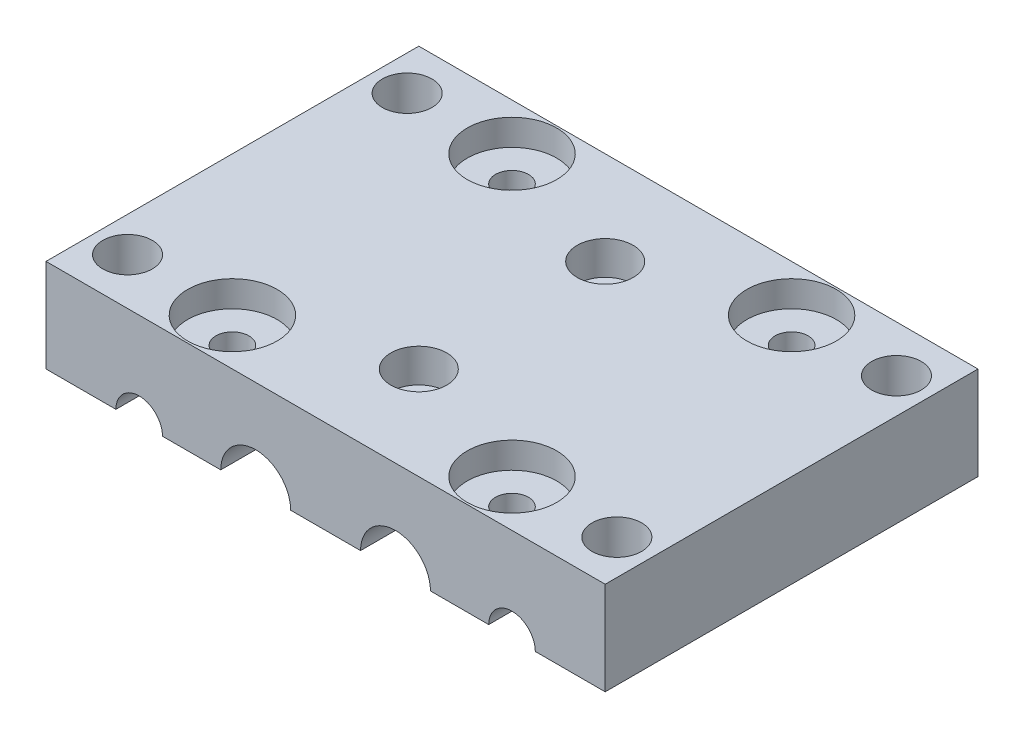
ISO-10303-21;
HEADER;
FILE_DESCRIPTION(('STEP AP214'),'2;1');
FILE_NAME('part.step','',(''),(''),'','','');
FILE_SCHEMA(('AUTOMOTIVE_DESIGN { 1 0 10303 214 1 1 1 1 }'));
ENDSEC;
DATA;
#1=APPLICATION_CONTEXT('core data for automotive mechanical design processes');
#2=APPLICATION_PROTOCOL_DEFINITION('international standard','automotive_design',2000,#1);
#3=PRODUCT_CONTEXT('',#1,'mechanical');
#4=PRODUCT('Part','Part','',(#3));
#5=PRODUCT_RELATED_PRODUCT_CATEGORY('part','',(#4));
#6=PRODUCT_DEFINITION_FORMATION('','',#4);
#7=PRODUCT_DEFINITION_CONTEXT('part definition',#1,'design');
#8=PRODUCT_DEFINITION('design','',#6,#7);
#9=PRODUCT_DEFINITION_SHAPE('','',#8);
#10=(LENGTH_UNIT() NAMED_UNIT(*) SI_UNIT(.MILLI.,.METRE.));
#11=(NAMED_UNIT(*) PLANE_ANGLE_UNIT() SI_UNIT($,.RADIAN.));
#12=(NAMED_UNIT(*) SI_UNIT($,.STERADIAN.) SOLID_ANGLE_UNIT());
#13=UNCERTAINTY_MEASURE_WITH_UNIT(LENGTH_MEASURE(1.E-05),#10,'distance_accuracy_value','');
#14=(GEOMETRIC_REPRESENTATION_CONTEXT(3) GLOBAL_UNCERTAINTY_ASSIGNED_CONTEXT((#13)) GLOBAL_UNIT_ASSIGNED_CONTEXT((#10,
#11,#12)) REPRESENTATION_CONTEXT('',''));
#15=CARTESIAN_POINT('',(0.,0.,0.));
#16=DIRECTION('',(0.,0.,1.));
#17=DIRECTION('',(1.,0.,0.));
#18=AXIS2_PLACEMENT_3D('',#15,#16,#17);
#19=CARTESIAN_POINT('',(19.05,12.7,-19.05));
#20=DIRECTION('',(0.,1.,0.));
#21=DIRECTION('',(0.,0.,1.));
#22=AXIS2_PLACEMENT_3D('',#19,#20,#21);
#23=CYLINDRICAL_SURFACE('',#22,2.24789999999999);
#24=CARTESIAN_POINT('',(19.05,0.,-19.05));
#25=DIRECTION('',(0.,1.,0.));
#26=DIRECTION('',(0.,0.,1.));
#27=AXIS2_PLACEMENT_3D('',#24,#25,#26);
#28=CIRCLE('',#27,2.24789999999999);
#29=CARTESIAN_POINT('',(19.05,0.,-16.8021));
#30=VERTEX_POINT('',#29);
#31=EDGE_CURVE('E244',#30,#30,#28,.T.);
#32=ORIENTED_EDGE('',*,*,#31,.F.);
#33=EDGE_LOOP('',(#32));
#34=FACE_BOUND('',#33,.T.);
#35=CARTESIAN_POINT('',(19.05,9.144,-19.05));
#36=DIRECTION('',(0.,1.,0.));
#37=DIRECTION('',(0.,0.,1.));
#38=AXIS2_PLACEMENT_3D('',#35,#36,#37);
#39=CIRCLE('',#38,2.24789999999999);
#40=CARTESIAN_POINT('',(19.05,9.144,-16.8021));
#41=VERTEX_POINT('',#40);
#42=EDGE_CURVE('E38',#41,#41,#39,.F.);
#43=ORIENTED_EDGE('',*,*,#42,.F.);
#44=EDGE_LOOP('',(#43));
#45=FACE_BOUND('',#44,.T.);
#46=ADVANCED_FACE('F34',(#34,#45),#23,.F.);
#47=CARTESIAN_POINT('',(19.05,12.7,19.05));
#48=DIRECTION('',(0.,1.,0.));
#49=DIRECTION('',(0.,0.,1.));
#50=AXIS2_PLACEMENT_3D('',#47,#48,#49);
#51=CYLINDRICAL_SURFACE('',#50,2.24789999999999);
#52=CARTESIAN_POINT('',(19.05,0.,19.05));
#53=DIRECTION('',(0.,1.,0.));
#54=DIRECTION('',(0.,0.,1.));
#55=AXIS2_PLACEMENT_3D('',#52,#53,#54);
#56=CIRCLE('',#55,2.24789999999999);
#57=CARTESIAN_POINT('',(19.05,0.,21.2979));
#58=VERTEX_POINT('',#57);
#59=EDGE_CURVE('E241',#58,#58,#56,.T.);
#60=ORIENTED_EDGE('',*,*,#59,.F.);
#61=EDGE_LOOP('',(#60));
#62=FACE_BOUND('',#61,.T.);
#63=CARTESIAN_POINT('',(19.05,9.144,19.05));
#64=DIRECTION('',(0.,1.,0.));
#65=DIRECTION('',(0.,0.,1.));
#66=AXIS2_PLACEMENT_3D('',#63,#64,#65);
#67=CIRCLE('',#66,2.24789999999999);
#68=CARTESIAN_POINT('',(19.05,9.144,21.2979));
#69=VERTEX_POINT('',#68);
#70=EDGE_CURVE('E203',#69,#69,#67,.F.);
#71=ORIENTED_EDGE('',*,*,#70,.F.);
#72=EDGE_LOOP('',(#71));
#73=FACE_BOUND('',#72,.T.);
#74=ADVANCED_FACE('F356',(#62,#73),#51,.F.);
#75=CARTESIAN_POINT('',(-19.05,12.7,19.05));
#76=DIRECTION('',(0.,1.,0.));
#77=DIRECTION('',(0.,0.,1.));
#78=AXIS2_PLACEMENT_3D('',#75,#76,#77);
#79=CYLINDRICAL_SURFACE('',#78,2.24789999999999);
#80=CARTESIAN_POINT('',(-19.05,0.,19.05));
#81=DIRECTION('',(0.,1.,0.));
#82=DIRECTION('',(0.,0.,1.));
#83=AXIS2_PLACEMENT_3D('',#80,#81,#82);
#84=CIRCLE('',#83,2.24789999999999);
#85=CARTESIAN_POINT('',(-19.05,0.,21.2979));
#86=VERTEX_POINT('',#85);
#87=EDGE_CURVE('E238',#86,#86,#84,.T.);
#88=ORIENTED_EDGE('',*,*,#87,.F.);
#89=EDGE_LOOP('',(#88));
#90=FACE_BOUND('',#89,.T.);
#91=CARTESIAN_POINT('',(-19.05,9.144,19.05));
#92=DIRECTION('',(0.,1.,0.));
#93=DIRECTION('',(0.,0.,1.));
#94=AXIS2_PLACEMENT_3D('',#91,#92,#93);
#95=CIRCLE('',#94,2.24789999999999);
#96=CARTESIAN_POINT('',(-19.05,9.144,21.2979));
#97=VERTEX_POINT('',#96);
#98=EDGE_CURVE('E199',#97,#97,#95,.F.);
#99=ORIENTED_EDGE('',*,*,#98,.F.);
#100=EDGE_LOOP('',(#99));
#101=FACE_BOUND('',#100,.T.);
#102=ADVANCED_FACE('F363',(#90,#101),#79,.F.);
#103=CARTESIAN_POINT('',(-19.05,12.7,-19.05));
#104=DIRECTION('',(0.,1.,0.));
#105=DIRECTION('',(0.,0.,1.));
#106=AXIS2_PLACEMENT_3D('',#103,#104,#105);
#107=CYLINDRICAL_SURFACE('',#106,2.24789999999999);
#108=CARTESIAN_POINT('',(-19.05,0.,-19.05));
#109=DIRECTION('',(0.,1.,0.));
#110=DIRECTION('',(0.,0.,1.));
#111=AXIS2_PLACEMENT_3D('',#108,#109,#110);
#112=CIRCLE('',#111,2.24789999999999);
#113=CARTESIAN_POINT('',(-19.05,0.,-16.8021));
#114=VERTEX_POINT('',#113);
#115=EDGE_CURVE('E187',#114,#114,#112,.T.);
#116=ORIENTED_EDGE('',*,*,#115,.F.);
#117=EDGE_LOOP('',(#116));
#118=FACE_BOUND('',#117,.T.);
#119=CARTESIAN_POINT('',(-19.05,9.144,-19.05));
#120=DIRECTION('',(0.,1.,0.));
#121=DIRECTION('',(0.,0.,1.));
#122=AXIS2_PLACEMENT_3D('',#119,#120,#121);
#123=CIRCLE('',#122,2.24789999999999);
#124=CARTESIAN_POINT('',(-19.05,9.144,-16.8021));
#125=VERTEX_POINT('',#124);
#126=EDGE_CURVE('E194',#125,#125,#123,.F.);
#127=ORIENTED_EDGE('',*,*,#126,.F.);
#128=EDGE_LOOP('',(#127));
#129=FACE_BOUND('',#128,.T.);
#130=ADVANCED_FACE('F377',(#118,#129),#107,.F.);
#131=CARTESIAN_POINT('',(0.,12.7,12.7));
#132=DIRECTION('',(0.,1.,0.));
#133=DIRECTION('',(0.,0.,1.));
#134=AXIS2_PLACEMENT_3D('',#131,#132,#133);
#135=CYLINDRICAL_SURFACE('',#134,2.24789999999999);
#136=CARTESIAN_POINT('',(0.,0.,12.7));
#137=DIRECTION('',(0.,1.,0.));
#138=DIRECTION('',(0.,0.,1.));
#139=AXIS2_PLACEMENT_3D('',#136,#137,#138);
#140=CIRCLE('',#139,2.24789999999999);
#141=CARTESIAN_POINT('',(0.,0.,14.9479));
#142=VERTEX_POINT('',#141);
#143=EDGE_CURVE('E250',#142,#142,#140,.T.);
#144=ORIENTED_EDGE('',*,*,#143,.F.);
#145=EDGE_LOOP('',(#144));
#146=FACE_BOUND('',#145,.T.);
#147=CARTESIAN_POINT('',(0.,8.128,12.7));
#148=DIRECTION('',(0.,1.,0.));
#149=DIRECTION('',(0.,0.,1.));
#150=AXIS2_PLACEMENT_3D('',#147,#148,#149);
#151=CIRCLE('',#150,2.24789999999999);
#152=CARTESIAN_POINT('',(0.,8.128,14.9479));
#153=VERTEX_POINT('',#152);
#154=EDGE_CURVE('E189',#153,#153,#151,.F.);
#155=ORIENTED_EDGE('',*,*,#154,.F.);
#156=EDGE_LOOP('',(#155));
#157=FACE_BOUND('',#156,.T.);
#158=ADVANCED_FACE('F373',(#146,#157),#135,.F.);
#159=CARTESIAN_POINT('',(0.,12.7,-12.7));
#160=DIRECTION('',(0.,1.,0.));
#161=DIRECTION('',(0.,0.,1.));
#162=AXIS2_PLACEMENT_3D('',#159,#160,#161);
#163=CYLINDRICAL_SURFACE('',#162,2.24789999999999);
#164=CARTESIAN_POINT('',(0.,0.,-12.7));
#165=DIRECTION('',(0.,1.,0.));
#166=DIRECTION('',(0.,0.,1.));
#167=AXIS2_PLACEMENT_3D('',#164,#165,#166);
#168=CIRCLE('',#167,2.24789999999999);
#169=CARTESIAN_POINT('',(0.,0.,-10.4521));
#170=VERTEX_POINT('',#169);
#171=EDGE_CURVE('E247',#170,#170,#168,.T.);
#172=ORIENTED_EDGE('',*,*,#171,.F.);
#173=EDGE_LOOP('',(#172));
#174=FACE_BOUND('',#173,.T.);
#175=CARTESIAN_POINT('',(0.,8.128,-12.7));
#176=DIRECTION('',(0.,1.,0.));
#177=DIRECTION('',(0.,0.,1.));
#178=AXIS2_PLACEMENT_3D('',#175,#176,#177);
#179=CIRCLE('',#178,2.24789999999999);
#180=CARTESIAN_POINT('',(0.,8.128,-10.4521));
#181=VERTEX_POINT('',#180);
#182=EDGE_CURVE('E184',#181,#181,#179,.F.);
#183=ORIENTED_EDGE('',*,*,#182,.F.);
#184=EDGE_LOOP('',(#183));
#185=FACE_BOUND('',#184,.T.);
#186=ADVANCED_FACE('F370',(#174,#185),#163,.F.);
#187=CARTESIAN_POINT('',(0.,0.,0.));
#188=DIRECTION('',(0.,1.,0.));
#189=DIRECTION('',(0.,0.,1.));
#190=AXIS2_PLACEMENT_3D('',#187,#188,#189);
#191=PLANE('',#190);
#192=ORIENTED_EDGE('',*,*,#171,.T.);
#193=EDGE_LOOP('',(#192));
#194=FACE_BOUND('',#193,.T.);
#195=ORIENTED_EDGE('',*,*,#143,.T.);
#196=EDGE_LOOP('',(#195));
#197=FACE_BOUND('',#196,.T.);
#198=DIRECTION('',(-1.,0.,0.));
#199=VECTOR('',#198,1.);
#200=CARTESIAN_POINT('',(-38.1,0.,-25.4));
#201=LINE('',#200,#199);
#202=CARTESIAN_POINT('',(4.7625,0.,-25.4));
#203=VERTEX_POINT('',#202);
#204=CARTESIAN_POINT('',(-4.7625,0.,-25.4));
#205=VERTEX_POINT('',#204);
#206=EDGE_CURVE('E145',#203,#205,#201,.T.);
#207=ORIENTED_EDGE('',*,*,#206,.F.);
#208=DIRECTION('',(0.,0.,1.));
#209=VECTOR('',#208,1.);
#210=CARTESIAN_POINT('',(4.7625,0.,-25.4));
#211=LINE('',#210,#209);
#212=CARTESIAN_POINT('',(4.7625,0.,25.4));
#213=VERTEX_POINT('',#212);
#214=EDGE_CURVE('E51',#203,#213,#211,.T.);
#215=ORIENTED_EDGE('',*,*,#214,.T.);
#216=DIRECTION('',(1.,0.,0.));
#217=VECTOR('',#216,1.);
#218=CARTESIAN_POINT('',(-38.1,0.,25.4));
#219=LINE('',#218,#217);
#220=CARTESIAN_POINT('',(-4.7625,0.,25.4));
#221=VERTEX_POINT('',#220);
#222=EDGE_CURVE('E327',#221,#213,#219,.T.);
#223=ORIENTED_EDGE('',*,*,#222,.F.);
#224=DIRECTION('',(0.,0.,1.));
#225=VECTOR('',#224,1.);
#226=CARTESIAN_POINT('',(-4.7625,0.,-25.4));
#227=LINE('',#226,#225);
#228=EDGE_CURVE('E281',#221,#205,#227,.F.);
#229=ORIENTED_EDGE('',*,*,#228,.T.);
#230=EDGE_LOOP('',(#207,#215,#223,#229));
#231=FACE_BOUND('',#230,.T.);
#232=ADVANCED_FACE('F349',(#194,#197,#231),#191,.F.);
#233=ORIENTED_EDGE('',*,*,#115,.T.);
#234=EDGE_LOOP('',(#233));
#235=FACE_BOUND('',#234,.T.);
#236=ORIENTED_EDGE('',*,*,#87,.T.);
#237=EDGE_LOOP('',(#236));
#238=FACE_BOUND('',#237,.T.);
#239=CARTESIAN_POINT('',(-14.2875,0.,-25.4));
#240=VERTEX_POINT('',#239);
#241=CARTESIAN_POINT('',(-22.225,0.,-25.4));
#242=VERTEX_POINT('',#241);
#243=EDGE_CURVE('E148',#240,#242,#201,.T.);
#244=ORIENTED_EDGE('',*,*,#243,.F.);
#245=DIRECTION('',(0.,0.,1.));
#246=VECTOR('',#245,1.);
#247=CARTESIAN_POINT('',(-14.2875,0.,-25.4));
#248=LINE('',#247,#246);
#249=CARTESIAN_POINT('',(-14.2875,0.,25.4));
#250=VERTEX_POINT('',#249);
#251=EDGE_CURVE('E59',#240,#250,#248,.T.);
#252=ORIENTED_EDGE('',*,*,#251,.T.);
#253=CARTESIAN_POINT('',(-22.225,0.,25.4));
#254=VERTEX_POINT('',#253);
#255=EDGE_CURVE('E173',#254,#250,#219,.T.);
#256=ORIENTED_EDGE('',*,*,#255,.F.);
#257=DIRECTION('',(0.,0.,1.));
#258=VECTOR('',#257,1.);
#259=CARTESIAN_POINT('',(-22.225,0.,-25.4));
#260=LINE('',#259,#258);
#261=EDGE_CURVE('E163',#254,#242,#260,.F.);
#262=ORIENTED_EDGE('',*,*,#261,.T.);
#263=EDGE_LOOP('',(#244,#252,#256,#262));
#264=FACE_BOUND('',#263,.T.);
#265=ADVANCED_FACE('F171',(#235,#238,#264),#191,.F.);
#266=ORIENTED_EDGE('',*,*,#59,.T.);
#267=EDGE_LOOP('',(#266));
#268=FACE_BOUND('',#267,.T.);
#269=ORIENTED_EDGE('',*,*,#31,.T.);
#270=EDGE_LOOP('',(#269));
#271=FACE_BOUND('',#270,.T.);
#272=CARTESIAN_POINT('',(14.2875,0.,25.4));
#273=VERTEX_POINT('',#272);
#274=CARTESIAN_POINT('',(22.225,0.,25.4));
#275=VERTEX_POINT('',#274);
#276=EDGE_CURVE('E138',#273,#275,#219,.T.);
#277=ORIENTED_EDGE('',*,*,#276,.F.);
#278=DIRECTION('',(0.,0.,1.));
#279=VECTOR('',#278,1.);
#280=CARTESIAN_POINT('',(14.2875,0.,-25.4));
#281=LINE('',#280,#279);
#282=CARTESIAN_POINT('',(14.2875,0.,-25.4));
#283=VERTEX_POINT('',#282);
#284=EDGE_CURVE('E126',#273,#283,#281,.F.);
#285=ORIENTED_EDGE('',*,*,#284,.T.);
#286=CARTESIAN_POINT('',(22.225,0.,-25.4));
#287=VERTEX_POINT('',#286);
#288=EDGE_CURVE('E137',#287,#283,#201,.T.);
#289=ORIENTED_EDGE('',*,*,#288,.F.);
#290=DIRECTION('',(0.,0.,1.));
#291=VECTOR('',#290,1.);
#292=CARTESIAN_POINT('',(22.225,0.,-25.4));
#293=LINE('',#292,#291);
#294=EDGE_CURVE('E11',#287,#275,#293,.T.);
#295=ORIENTED_EDGE('',*,*,#294,.T.);
#296=EDGE_LOOP('',(#277,#285,#289,#295));
#297=FACE_BOUND('',#296,.T.);
#298=ADVANCED_FACE('F136',(#268,#271,#297),#191,.F.);
#299=CARTESIAN_POINT('',(-33.3375,0.,19.05));
#300=DIRECTION('',(0.,1.,0.));
#301=DIRECTION('',(0.,0.,1.));
#302=AXIS2_PLACEMENT_3D('',#299,#300,#301);
#303=CIRCLE('',#302,3.37819999999999);
#304=CARTESIAN_POINT('',(-33.3375,0.,22.4282));
#305=VERTEX_POINT('',#304);
#306=EDGE_CURVE('E256',#305,#305,#303,.T.);
#307=ORIENTED_EDGE('',*,*,#306,.T.);
#308=EDGE_LOOP('',(#307));
#309=FACE_BOUND('',#308,.T.);
#310=CARTESIAN_POINT('',(-33.3375,0.,-19.05));
#311=DIRECTION('',(0.,1.,0.));
#312=DIRECTION('',(0.,0.,1.));
#313=AXIS2_PLACEMENT_3D('',#310,#311,#312);
#314=CIRCLE('',#313,3.37819999999999);
#315=CARTESIAN_POINT('',(-33.3375,0.,-15.6718));
#316=VERTEX_POINT('',#315);
#317=EDGE_CURVE('E262',#316,#316,#314,.T.);
#318=ORIENTED_EDGE('',*,*,#317,.T.);
#319=EDGE_LOOP('',(#318));
#320=FACE_BOUND('',#319,.T.);
#321=CARTESIAN_POINT('',(-28.575,0.,-25.4));
#322=VERTEX_POINT('',#321);
#323=CARTESIAN_POINT('',(-38.1,0.,-25.4));
#324=VERTEX_POINT('',#323);
#325=EDGE_CURVE('E147',#322,#324,#201,.T.);
#326=ORIENTED_EDGE('',*,*,#325,.F.);
#327=DIRECTION('',(0.,0.,1.));
#328=VECTOR('',#327,1.);
#329=CARTESIAN_POINT('',(-28.575,0.,-25.4));
#330=LINE('',#329,#328);
#331=CARTESIAN_POINT('',(-28.575,0.,25.4));
#332=VERTEX_POINT('',#331);
#333=EDGE_CURVE('E166',#322,#332,#330,.T.);
#334=ORIENTED_EDGE('',*,*,#333,.T.);
#335=CARTESIAN_POINT('',(-38.1,0.,25.4));
#336=VERTEX_POINT('',#335);
#337=EDGE_CURVE('E303',#336,#332,#219,.T.);
#338=ORIENTED_EDGE('',*,*,#337,.F.);
#339=DIRECTION('',(0.,0.,1.));
#340=VECTOR('',#339,1.);
#341=CARTESIAN_POINT('',(-38.1,0.,-25.4));
#342=LINE('',#341,#340);
#343=EDGE_CURVE('E167',#324,#336,#342,.T.);
#344=ORIENTED_EDGE('',*,*,#343,.F.);
#345=EDGE_LOOP('',(#326,#334,#338,#344));
#346=FACE_BOUND('',#345,.T.);
#347=ADVANCED_FACE('F331',(#309,#320,#346),#191,.F.);
#348=CARTESIAN_POINT('',(-38.1,12.7,-25.4));
#349=DIRECTION('',(1.,0.,0.));
#350=DIRECTION('',(0.,0.,-1.));
#351=AXIS2_PLACEMENT_3D('',#348,#349,#350);
#352=PLANE('',#351);
#353=ORIENTED_EDGE('',*,*,#343,.T.);
#354=DIRECTION('',(0.,-1.,0.));
#355=VECTOR('',#354,1.);
#356=CARTESIAN_POINT('',(-38.1,12.7,25.4));
#357=LINE('',#356,#355);
#358=CARTESIAN_POINT('',(-38.1,12.7,25.4));
#359=VERTEX_POINT('',#358);
#360=EDGE_CURVE('E174',#359,#336,#357,.T.);
#361=ORIENTED_EDGE('',*,*,#360,.F.);
#362=DIRECTION('',(0.,0.,1.));
#363=VECTOR('',#362,1.);
#364=CARTESIAN_POINT('',(-38.1,12.7,-25.4));
#365=LINE('',#364,#363);
#366=CARTESIAN_POINT('',(-38.1,12.7,-25.4));
#367=VERTEX_POINT('',#366);
#368=EDGE_CURVE('E149',#367,#359,#365,.T.);
#369=ORIENTED_EDGE('',*,*,#368,.F.);
#370=DIRECTION('',(0.,-1.,0.));
#371=VECTOR('',#370,1.);
#372=CARTESIAN_POINT('',(-38.1,12.7,-25.4));
#373=LINE('',#372,#371);
#374=EDGE_CURVE('E299',#367,#324,#373,.T.);
#375=ORIENTED_EDGE('',*,*,#374,.T.);
#376=EDGE_LOOP('',(#353,#361,#369,#375));
#377=FACE_BOUND('',#376,.T.);
#378=ADVANCED_FACE('F36',(#377),#352,.F.);
#379=CARTESIAN_POINT('',(-38.1,12.7,25.4));
#380=DIRECTION('',(0.,0.,-1.));
#381=DIRECTION('',(-1.,0.,0.));
#382=AXIS2_PLACEMENT_3D('',#379,#380,#381);
#383=PLANE('',#382);
#384=ORIENTED_EDGE('',*,*,#222,.T.);
#385=CARTESIAN_POINT('',(9.525,0.,25.4));
#386=DIRECTION('',(0.,0.,1.));
#387=DIRECTION('',(1.,0.,0.));
#388=AXIS2_PLACEMENT_3D('',#385,#386,#387);
#389=CIRCLE('',#388,4.7625);
#390=EDGE_CURVE('E131',#273,#213,#389,.T.);
#391=ORIENTED_EDGE('',*,*,#390,.F.);
#392=ORIENTED_EDGE('',*,*,#276,.T.);
#393=CARTESIAN_POINT('',(25.4,0.,25.4));
#394=DIRECTION('',(0.,0.,1.));
#395=DIRECTION('',(1.,0.,0.));
#396=AXIS2_PLACEMENT_3D('',#393,#394,#395);
#397=CIRCLE('',#396,3.175);
#398=CARTESIAN_POINT('',(28.575,0.,25.4));
#399=VERTEX_POINT('',#398);
#400=EDGE_CURVE('E286',#399,#275,#397,.T.);
#401=ORIENTED_EDGE('',*,*,#400,.F.);
#402=CARTESIAN_POINT('',(38.1,0.,25.4));
#403=VERTEX_POINT('',#402);
#404=EDGE_CURVE('E302',#399,#403,#219,.T.);
#405=ORIENTED_EDGE('',*,*,#404,.T.);
#406=DIRECTION('',(0.,-1.,0.));
#407=VECTOR('',#406,1.);
#408=CARTESIAN_POINT('',(38.1,12.7,25.4));
#409=LINE('',#408,#407);
#410=CARTESIAN_POINT('',(38.1,12.7,25.4));
#411=VERTEX_POINT('',#410);
#412=EDGE_CURVE('E178',#411,#403,#409,.T.);
#413=ORIENTED_EDGE('',*,*,#412,.F.);
#414=DIRECTION('',(1.,0.,0.));
#415=VECTOR('',#414,1.);
#416=CARTESIAN_POINT('',(-38.1,12.7,25.4));
#417=LINE('',#416,#415);
#418=EDGE_CURVE('E293',#359,#411,#417,.T.);
#419=ORIENTED_EDGE('',*,*,#418,.F.);
#420=ORIENTED_EDGE('',*,*,#360,.T.);
#421=ORIENTED_EDGE('',*,*,#337,.T.);
#422=CARTESIAN_POINT('',(-25.4,0.,25.4));
#423=DIRECTION('',(0.,0.,1.));
#424=DIRECTION('',(1.,0.,0.));
#425=AXIS2_PLACEMENT_3D('',#422,#423,#424);
#426=CIRCLE('',#425,3.175);
#427=EDGE_CURVE('E168',#254,#332,#426,.T.);
#428=ORIENTED_EDGE('',*,*,#427,.F.);
#429=ORIENTED_EDGE('',*,*,#255,.T.);
#430=CARTESIAN_POINT('',(-9.525,0.,25.4));
#431=DIRECTION('',(0.,0.,1.));
#432=DIRECTION('',(1.,0.,0.));
#433=AXIS2_PLACEMENT_3D('',#430,#431,#432);
#434=CIRCLE('',#433,4.7625);
#435=EDGE_CURVE('E279',#221,#250,#434,.T.);
#436=ORIENTED_EDGE('',*,*,#435,.F.);
#437=EDGE_LOOP('',(#384,#391,#392,#401,#405,#413,#419,#420,#421,#428,#429,#436));
#438=FACE_BOUND('',#437,.T.);
#439=ADVANCED_FACE('F326',(#438),#383,.F.);
#440=CARTESIAN_POINT('',(38.1,12.7,-25.4));
#441=DIRECTION('',(-1.,0.,0.));
#442=DIRECTION('',(0.,0.,1.));
#443=AXIS2_PLACEMENT_3D('',#440,#441,#442);
#444=PLANE('',#443);
#445=DIRECTION('',(0.,0.,-1.));
#446=VECTOR('',#445,1.);
#447=CARTESIAN_POINT('',(38.1,0.,-25.4));
#448=LINE('',#447,#446);
#449=CARTESIAN_POINT('',(38.1,0.,-25.4));
#450=VERTEX_POINT('',#449);
#451=EDGE_CURVE('E152',#403,#450,#448,.T.);
#452=ORIENTED_EDGE('',*,*,#451,.T.);
#453=DIRECTION('',(0.,-1.,0.));
#454=VECTOR('',#453,1.);
#455=CARTESIAN_POINT('',(38.1,12.7,-25.4));
#456=LINE('',#455,#454);
#457=CARTESIAN_POINT('',(38.1,12.7,-25.4));
#458=VERTEX_POINT('',#457);
#459=EDGE_CURVE('E312',#458,#450,#456,.T.);
#460=ORIENTED_EDGE('',*,*,#459,.F.);
#461=DIRECTION('',(0.,0.,-1.));
#462=VECTOR('',#461,1.);
#463=CARTESIAN_POINT('',(38.1,12.7,-25.4));
#464=LINE('',#463,#462);
#465=EDGE_CURVE('E295',#411,#458,#464,.T.);
#466=ORIENTED_EDGE('',*,*,#465,.F.);
#467=ORIENTED_EDGE('',*,*,#412,.T.);
#468=EDGE_LOOP('',(#452,#460,#466,#467));
#469=FACE_BOUND('',#468,.T.);
#470=ADVANCED_FACE('F310',(#469),#444,.F.);
#471=CARTESIAN_POINT('',(-38.1,12.7,-25.4));
#472=DIRECTION('',(0.,0.,1.));
#473=DIRECTION('',(1.,0.,0.));
#474=AXIS2_PLACEMENT_3D('',#471,#472,#473);
#475=PLANE('',#474);
#476=ORIENTED_EDGE('',*,*,#288,.T.);
#477=CARTESIAN_POINT('',(9.525,0.,-25.4));
#478=DIRECTION('',(0.,0.,1.));
#479=DIRECTION('',(1.,0.,0.));
#480=AXIS2_PLACEMENT_3D('',#477,#478,#479);
#481=CIRCLE('',#480,4.7625);
#482=EDGE_CURVE('E123',#283,#203,#481,.T.);
#483=ORIENTED_EDGE('',*,*,#482,.T.);
#484=ORIENTED_EDGE('',*,*,#206,.T.);
#485=CARTESIAN_POINT('',(-9.525,0.,-25.4));
#486=DIRECTION('',(0.,0.,1.));
#487=DIRECTION('',(1.,0.,0.));
#488=AXIS2_PLACEMENT_3D('',#485,#486,#487);
#489=CIRCLE('',#488,4.7625);
#490=EDGE_CURVE('E158',#205,#240,#489,.T.);
#491=ORIENTED_EDGE('',*,*,#490,.T.);
#492=ORIENTED_EDGE('',*,*,#243,.T.);
#493=CARTESIAN_POINT('',(-25.4,0.,-25.4));
#494=DIRECTION('',(0.,0.,1.));
#495=DIRECTION('',(1.,0.,0.));
#496=AXIS2_PLACEMENT_3D('',#493,#494,#495);
#497=CIRCLE('',#496,3.175);
#498=EDGE_CURVE('E156',#242,#322,#497,.T.);
#499=ORIENTED_EDGE('',*,*,#498,.T.);
#500=ORIENTED_EDGE('',*,*,#325,.T.);
#501=ORIENTED_EDGE('',*,*,#374,.F.);
#502=DIRECTION('',(-1.,0.,0.));
#503=VECTOR('',#502,1.);
#504=CARTESIAN_POINT('',(-38.1,12.7,-25.4));
#505=LINE('',#504,#503);
#506=EDGE_CURVE('E297',#458,#367,#505,.T.);
#507=ORIENTED_EDGE('',*,*,#506,.F.);
#508=ORIENTED_EDGE('',*,*,#459,.T.);
#509=CARTESIAN_POINT('',(28.575,0.,-25.4));
#510=VERTEX_POINT('',#509);
#511=EDGE_CURVE('E144',#450,#510,#201,.T.);
#512=ORIENTED_EDGE('',*,*,#511,.T.);
#513=CARTESIAN_POINT('',(25.4,0.,-25.4));
#514=DIRECTION('',(0.,0.,1.));
#515=DIRECTION('',(1.,0.,0.));
#516=AXIS2_PLACEMENT_3D('',#513,#514,#515);
#517=CIRCLE('',#516,3.175);
#518=EDGE_CURVE('E143',#510,#287,#517,.T.);
#519=ORIENTED_EDGE('',*,*,#518,.T.);
#520=EDGE_LOOP('',(#476,#483,#484,#491,#492,#499,#500,#501,#507,#508,#512,#519));
#521=FACE_BOUND('',#520,.T.);
#522=ADVANCED_FACE('F141',(#521),#475,.F.);
#523=CARTESIAN_POINT('',(0.,12.7,0.));
#524=DIRECTION('',(0.,1.,0.));
#525=DIRECTION('',(0.,0.,1.));
#526=AXIS2_PLACEMENT_3D('',#523,#524,#525);
#527=PLANE('',#526);
#528=CARTESIAN_POINT('',(19.05,12.7,-19.05));
#529=DIRECTION('',(0.,1.,0.));
#530=DIRECTION('',(0.,0.,1.));
#531=AXIS2_PLACEMENT_3D('',#528,#529,#530);
#532=CIRCLE('',#531,6.096);
#533=CARTESIAN_POINT('',(19.05,12.7,-12.954));
#534=VERTEX_POINT('',#533);
#535=EDGE_CURVE('E219',#534,#534,#532,.T.);
#536=ORIENTED_EDGE('',*,*,#535,.F.);
#537=EDGE_LOOP('',(#536));
#538=FACE_BOUND('',#537,.T.);
#539=CARTESIAN_POINT('',(19.05,12.7,19.05));
#540=DIRECTION('',(0.,1.,0.));
#541=DIRECTION('',(0.,0.,1.));
#542=AXIS2_PLACEMENT_3D('',#539,#540,#541);
#543=CIRCLE('',#542,6.096);
#544=CARTESIAN_POINT('',(19.05,12.7,25.146));
#545=VERTEX_POINT('',#544);
#546=EDGE_CURVE('E212',#545,#545,#543,.T.);
#547=ORIENTED_EDGE('',*,*,#546,.F.);
#548=EDGE_LOOP('',(#547));
#549=FACE_BOUND('',#548,.T.);
#550=CARTESIAN_POINT('',(-19.05,12.7,19.05));
#551=DIRECTION('',(0.,1.,0.));
#552=DIRECTION('',(0.,0.,1.));
#553=AXIS2_PLACEMENT_3D('',#550,#551,#552);
#554=CIRCLE('',#553,6.096);
#555=CARTESIAN_POINT('',(-19.05,12.7,25.146));
#556=VERTEX_POINT('',#555);
#557=EDGE_CURVE('E205',#556,#556,#554,.T.);
#558=ORIENTED_EDGE('',*,*,#557,.F.);
#559=EDGE_LOOP('',(#558));
#560=FACE_BOUND('',#559,.T.);
#561=CARTESIAN_POINT('',(-19.05,12.7,-19.05));
#562=DIRECTION('',(0.,1.,0.));
#563=DIRECTION('',(0.,0.,1.));
#564=AXIS2_PLACEMENT_3D('',#561,#562,#563);
#565=CIRCLE('',#564,6.096);
#566=CARTESIAN_POINT('',(-19.05,12.7,-12.954));
#567=VERTEX_POINT('',#566);
#568=EDGE_CURVE('E201',#567,#567,#565,.T.);
#569=ORIENTED_EDGE('',*,*,#568,.F.);
#570=EDGE_LOOP('',(#569));
#571=FACE_BOUND('',#570,.T.);
#572=CARTESIAN_POINT('',(0.,12.7,12.7));
#573=DIRECTION('',(0.,1.,0.));
#574=DIRECTION('',(0.,0.,1.));
#575=AXIS2_PLACEMENT_3D('',#572,#573,#574);
#576=CIRCLE('',#575,3.81);
#577=CARTESIAN_POINT('',(0.,12.7,16.51));
#578=VERTEX_POINT('',#577);
#579=EDGE_CURVE('E197',#578,#578,#576,.T.);
#580=ORIENTED_EDGE('',*,*,#579,.F.);
#581=EDGE_LOOP('',(#580));
#582=FACE_BOUND('',#581,.T.);
#583=CARTESIAN_POINT('',(0.,12.7,-12.7));
#584=DIRECTION('',(0.,1.,0.));
#585=DIRECTION('',(0.,0.,1.));
#586=AXIS2_PLACEMENT_3D('',#583,#584,#585);
#587=CIRCLE('',#586,3.81);
#588=CARTESIAN_POINT('',(0.,12.7,-8.89));
#589=VERTEX_POINT('',#588);
#590=EDGE_CURVE('E192',#589,#589,#587,.T.);
#591=ORIENTED_EDGE('',*,*,#590,.F.);
#592=EDGE_LOOP('',(#591));
#593=FACE_BOUND('',#592,.T.);
#594=CARTESIAN_POINT('',(-33.3375,12.7,19.05));
#595=DIRECTION('',(0.,1.,0.));
#596=DIRECTION('',(0.,0.,1.));
#597=AXIS2_PLACEMENT_3D('',#594,#595,#596);
#598=CIRCLE('',#597,3.37819999999999);
#599=CARTESIAN_POINT('',(-33.3375,12.7,22.4282));
#600=VERTEX_POINT('',#599);
#601=EDGE_CURVE('E253',#600,#600,#598,.T.);
#602=ORIENTED_EDGE('',*,*,#601,.F.);
#603=EDGE_LOOP('',(#602));
#604=FACE_BOUND('',#603,.T.);
#605=CARTESIAN_POINT('',(-33.3375,12.7,-19.05));
#606=DIRECTION('',(0.,1.,0.));
#607=DIRECTION('',(0.,0.,1.));
#608=AXIS2_PLACEMENT_3D('',#605,#606,#607);
#609=CIRCLE('',#608,3.37819999999999);
#610=CARTESIAN_POINT('',(-33.3375,12.7,-15.6718));
#611=VERTEX_POINT('',#610);
#612=EDGE_CURVE('E259',#611,#611,#609,.T.);
#613=ORIENTED_EDGE('',*,*,#612,.F.);
#614=EDGE_LOOP('',(#613));
#615=FACE_BOUND('',#614,.T.);
#616=CARTESIAN_POINT('',(33.3375,12.7,-19.05));
#617=DIRECTION('',(0.,1.,0.));
#618=DIRECTION('',(0.,0.,1.));
#619=AXIS2_PLACEMENT_3D('',#616,#617,#618);
#620=CIRCLE('',#619,3.37819999999998);
#621=CARTESIAN_POINT('',(33.3375,12.7,-15.6718));
#622=VERTEX_POINT('',#621);
#623=EDGE_CURVE('E265',#622,#622,#620,.T.);
#624=ORIENTED_EDGE('',*,*,#623,.F.);
#625=EDGE_LOOP('',(#624));
#626=FACE_BOUND('',#625,.T.);
#627=CARTESIAN_POINT('',(33.3375,12.7,19.05));
#628=DIRECTION('',(0.,1.,0.));
#629=DIRECTION('',(0.,0.,1.));
#630=AXIS2_PLACEMENT_3D('',#627,#628,#629);
#631=CIRCLE('',#630,3.37819999999999);
#632=CARTESIAN_POINT('',(33.3375,12.7,22.4282));
#633=VERTEX_POINT('',#632);
#634=EDGE_CURVE('E271',#633,#633,#631,.T.);
#635=ORIENTED_EDGE('',*,*,#634,.F.);
#636=EDGE_LOOP('',(#635));
#637=FACE_BOUND('',#636,.T.);
#638=ORIENTED_EDGE('',*,*,#368,.T.);
#639=ORIENTED_EDGE('',*,*,#418,.T.);
#640=ORIENTED_EDGE('',*,*,#465,.T.);
#641=ORIENTED_EDGE('',*,*,#506,.T.);
#642=EDGE_LOOP('',(#638,#639,#640,#641));
#643=FACE_BOUND('',#642,.T.);
#644=ADVANCED_FACE('F338',(#538,#549,#560,#571,#582,#593,#604,#615,#626,#637,#643),#527,.T.);
#645=CARTESIAN_POINT('',(33.3375,0.,-19.05));
#646=DIRECTION('',(0.,1.,0.));
#647=DIRECTION('',(0.,0.,1.));
#648=AXIS2_PLACEMENT_3D('',#645,#646,#647);
#649=CIRCLE('',#648,3.37819999999999);
#650=CARTESIAN_POINT('',(33.3375,0.,-15.6718));
#651=VERTEX_POINT('',#650);
#652=EDGE_CURVE('E268',#651,#651,#649,.T.);
#653=ORIENTED_EDGE('',*,*,#652,.T.);
#654=EDGE_LOOP('',(#653));
#655=FACE_BOUND('',#654,.T.);
#656=CARTESIAN_POINT('',(33.3375,0.,19.05));
#657=DIRECTION('',(0.,1.,0.));
#658=DIRECTION('',(0.,0.,1.));
#659=AXIS2_PLACEMENT_3D('',#656,#657,#658);
#660=CIRCLE('',#659,3.37819999999999);
#661=CARTESIAN_POINT('',(33.3375,0.,22.4282));
#662=VERTEX_POINT('',#661);
#663=EDGE_CURVE('E274',#662,#662,#660,.T.);
#664=ORIENTED_EDGE('',*,*,#663,.T.);
#665=EDGE_LOOP('',(#664));
#666=FACE_BOUND('',#665,.T.);
#667=ORIENTED_EDGE('',*,*,#404,.F.);
#668=DIRECTION('',(0.,0.,1.));
#669=VECTOR('',#668,1.);
#670=CARTESIAN_POINT('',(28.575,0.,-25.4));
#671=LINE('',#670,#669);
#672=EDGE_CURVE('E43',#399,#510,#671,.F.);
#673=ORIENTED_EDGE('',*,*,#672,.T.);
#674=ORIENTED_EDGE('',*,*,#511,.F.);
#675=ORIENTED_EDGE('',*,*,#451,.F.);
#676=EDGE_LOOP('',(#667,#673,#674,#675));
#677=FACE_BOUND('',#676,.T.);
#678=ADVANCED_FACE('F320',(#655,#666,#677),#191,.F.);
#679=CARTESIAN_POINT('',(-25.4,0.,-25.4));
#680=DIRECTION('',(0.,0.,1.));
#681=DIRECTION('',(1.,0.,0.));
#682=AXIS2_PLACEMENT_3D('',#679,#680,#681);
#683=CYLINDRICAL_SURFACE('',#682,3.175);
#684=ORIENTED_EDGE('',*,*,#498,.F.);
#685=ORIENTED_EDGE('',*,*,#261,.F.);
#686=ORIENTED_EDGE('',*,*,#427,.T.);
#687=ORIENTED_EDGE('',*,*,#333,.F.);
#688=EDGE_LOOP('',(#684,#685,#686,#687));
#689=FACE_BOUND('',#688,.T.);
#690=ADVANCED_FACE('F162',(#689),#683,.F.);
#691=CARTESIAN_POINT('',(25.4,0.,-25.4));
#692=DIRECTION('',(0.,0.,1.));
#693=DIRECTION('',(1.,0.,0.));
#694=AXIS2_PLACEMENT_3D('',#691,#692,#693);
#695=CYLINDRICAL_SURFACE('',#694,3.175);
#696=ORIENTED_EDGE('',*,*,#518,.F.);
#697=ORIENTED_EDGE('',*,*,#672,.F.);
#698=ORIENTED_EDGE('',*,*,#400,.T.);
#699=ORIENTED_EDGE('',*,*,#294,.F.);
#700=EDGE_LOOP('',(#696,#697,#698,#699));
#701=FACE_BOUND('',#700,.T.);
#702=ADVANCED_FACE('F323',(#701),#695,.F.);
#703=CARTESIAN_POINT('',(-9.525,0.,-25.4));
#704=DIRECTION('',(0.,0.,1.));
#705=DIRECTION('',(1.,0.,0.));
#706=AXIS2_PLACEMENT_3D('',#703,#704,#705);
#707=CYLINDRICAL_SURFACE('',#706,4.7625);
#708=ORIENTED_EDGE('',*,*,#490,.F.);
#709=ORIENTED_EDGE('',*,*,#228,.F.);
#710=ORIENTED_EDGE('',*,*,#435,.T.);
#711=ORIENTED_EDGE('',*,*,#251,.F.);
#712=EDGE_LOOP('',(#708,#709,#710,#711));
#713=FACE_BOUND('',#712,.T.);
#714=ADVANCED_FACE('F398',(#713),#707,.F.);
#715=CARTESIAN_POINT('',(9.525,0.,-25.4));
#716=DIRECTION('',(0.,0.,1.));
#717=DIRECTION('',(1.,0.,0.));
#718=AXIS2_PLACEMENT_3D('',#715,#716,#717);
#719=CYLINDRICAL_SURFACE('',#718,4.7625);
#720=ORIENTED_EDGE('',*,*,#482,.F.);
#721=ORIENTED_EDGE('',*,*,#284,.F.);
#722=ORIENTED_EDGE('',*,*,#390,.T.);
#723=ORIENTED_EDGE('',*,*,#214,.F.);
#724=EDGE_LOOP('',(#720,#721,#722,#723));
#725=FACE_BOUND('',#724,.T.);
#726=ADVANCED_FACE('F125',(#725),#719,.F.);
#727=CARTESIAN_POINT('',(33.3375,12.7,19.05));
#728=DIRECTION('',(0.,1.,0.));
#729=DIRECTION('',(0.,0.,1.));
#730=AXIS2_PLACEMENT_3D('',#727,#728,#729);
#731=CYLINDRICAL_SURFACE('',#730,3.37819999999999);
#732=ORIENTED_EDGE('',*,*,#663,.F.);
#733=EDGE_LOOP('',(#732));
#734=FACE_BOUND('',#733,.T.);
#735=ORIENTED_EDGE('',*,*,#634,.T.);
#736=EDGE_LOOP('',(#735));
#737=FACE_BOUND('',#736,.T.);
#738=ADVANCED_FACE('F391',(#734,#737),#731,.F.);
#739=CARTESIAN_POINT('',(33.3375,12.7,-19.05));
#740=DIRECTION('',(0.,1.,0.));
#741=DIRECTION('',(0.,0.,1.));
#742=AXIS2_PLACEMENT_3D('',#739,#740,#741);
#743=CYLINDRICAL_SURFACE('',#742,3.37819999999999);
#744=ORIENTED_EDGE('',*,*,#652,.F.);
#745=EDGE_LOOP('',(#744));
#746=FACE_BOUND('',#745,.T.);
#747=ORIENTED_EDGE('',*,*,#623,.T.);
#748=EDGE_LOOP('',(#747));
#749=FACE_BOUND('',#748,.T.);
#750=ADVANCED_FACE('F387',(#746,#749),#743,.F.);
#751=CARTESIAN_POINT('',(-33.3375,12.7,-19.05));
#752=DIRECTION('',(0.,1.,0.));
#753=DIRECTION('',(0.,0.,1.));
#754=AXIS2_PLACEMENT_3D('',#751,#752,#753);
#755=CYLINDRICAL_SURFACE('',#754,3.37819999999999);
#756=ORIENTED_EDGE('',*,*,#317,.F.);
#757=EDGE_LOOP('',(#756));
#758=FACE_BOUND('',#757,.T.);
#759=ORIENTED_EDGE('',*,*,#612,.T.);
#760=EDGE_LOOP('',(#759));
#761=FACE_BOUND('',#760,.T.);
#762=ADVANCED_FACE('F383',(#758,#761),#755,.F.);
#763=CARTESIAN_POINT('',(-33.3375,12.7,19.05));
#764=DIRECTION('',(0.,1.,0.));
#765=DIRECTION('',(0.,0.,1.));
#766=AXIS2_PLACEMENT_3D('',#763,#764,#765);
#767=CYLINDRICAL_SURFACE('',#766,3.37819999999999);
#768=ORIENTED_EDGE('',*,*,#306,.F.);
#769=EDGE_LOOP('',(#768));
#770=FACE_BOUND('',#769,.T.);
#771=ORIENTED_EDGE('',*,*,#601,.T.);
#772=EDGE_LOOP('',(#771));
#773=FACE_BOUND('',#772,.T.);
#774=ADVANCED_FACE('F379',(#770,#773),#767,.F.);
#775=CARTESIAN_POINT('',(0.,8.128,-12.7));
#776=DIRECTION('',(0.,1.,0.));
#777=DIRECTION('',(0.,0.,1.));
#778=AXIS2_PLACEMENT_3D('',#775,#776,#777);
#779=PLANE('',#778);
#780=CARTESIAN_POINT('',(0.,8.128,-12.7));
#781=DIRECTION('',(0.,1.,0.));
#782=DIRECTION('',(0.,0.,1.));
#783=AXIS2_PLACEMENT_3D('',#780,#781,#782);
#784=CIRCLE('',#783,3.81);
#785=CARTESIAN_POINT('',(0.,8.128,-8.89));
#786=VERTEX_POINT('',#785);
#787=EDGE_CURVE('E188',#786,#786,#784,.T.);
#788=ORIENTED_EDGE('',*,*,#787,.T.);
#789=EDGE_LOOP('',(#788));
#790=FACE_BOUND('',#789,.T.);
#791=ORIENTED_EDGE('',*,*,#182,.T.);
#792=EDGE_LOOP('',(#791));
#793=FACE_BOUND('',#792,.T.);
#794=ADVANCED_FACE('F382',(#790,#793),#779,.T.);
#795=CARTESIAN_POINT('',(0.,8.128,-12.7));
#796=DIRECTION('',(0.,1.,0.));
#797=DIRECTION('',(0.,0.,1.));
#798=AXIS2_PLACEMENT_3D('',#795,#796,#797);
#799=CYLINDRICAL_SURFACE('',#798,3.81);
#800=ORIENTED_EDGE('',*,*,#787,.F.);
#801=EDGE_LOOP('',(#800));
#802=FACE_BOUND('',#801,.T.);
#803=ORIENTED_EDGE('',*,*,#590,.T.);
#804=EDGE_LOOP('',(#803));
#805=FACE_BOUND('',#804,.T.);
#806=ADVANCED_FACE('F455',(#802,#805),#799,.F.);
#807=CARTESIAN_POINT('',(0.,8.128,12.7));
#808=DIRECTION('',(0.,1.,0.));
#809=DIRECTION('',(0.,0.,1.));
#810=AXIS2_PLACEMENT_3D('',#807,#808,#809);
#811=PLANE('',#810);
#812=CARTESIAN_POINT('',(0.,8.128,12.7));
#813=DIRECTION('',(0.,1.,0.));
#814=DIRECTION('',(0.,0.,1.));
#815=AXIS2_PLACEMENT_3D('',#812,#813,#814);
#816=CIRCLE('',#815,3.81);
#817=CARTESIAN_POINT('',(0.,8.128,16.51));
#818=VERTEX_POINT('',#817);
#819=EDGE_CURVE('E193',#818,#818,#816,.T.);
#820=ORIENTED_EDGE('',*,*,#819,.T.);
#821=EDGE_LOOP('',(#820));
#822=FACE_BOUND('',#821,.T.);
#823=ORIENTED_EDGE('',*,*,#154,.T.);
#824=EDGE_LOOP('',(#823));
#825=FACE_BOUND('',#824,.T.);
#826=ADVANCED_FACE('F463',(#822,#825),#811,.T.);
#827=CARTESIAN_POINT('',(0.,8.128,12.7));
#828=DIRECTION('',(0.,1.,0.));
#829=DIRECTION('',(0.,0.,1.));
#830=AXIS2_PLACEMENT_3D('',#827,#828,#829);
#831=CYLINDRICAL_SURFACE('',#830,3.81);
#832=ORIENTED_EDGE('',*,*,#819,.F.);
#833=EDGE_LOOP('',(#832));
#834=FACE_BOUND('',#833,.T.);
#835=ORIENTED_EDGE('',*,*,#579,.T.);
#836=EDGE_LOOP('',(#835));
#837=FACE_BOUND('',#836,.T.);
#838=ADVANCED_FACE('F471',(#834,#837),#831,.F.);
#839=CARTESIAN_POINT('',(-19.05,9.144,-19.05));
#840=DIRECTION('',(0.,1.,0.));
#841=DIRECTION('',(0.,0.,1.));
#842=AXIS2_PLACEMENT_3D('',#839,#840,#841);
#843=PLANE('',#842);
#844=CARTESIAN_POINT('',(-19.05,9.144,-19.05));
#845=DIRECTION('',(0.,1.,0.));
#846=DIRECTION('',(0.,0.,1.));
#847=AXIS2_PLACEMENT_3D('',#844,#845,#846);
#848=CIRCLE('',#847,6.096);
#849=CARTESIAN_POINT('',(-19.05,9.144,-12.954));
#850=VERTEX_POINT('',#849);
#851=EDGE_CURVE('E198',#850,#850,#848,.T.);
#852=ORIENTED_EDGE('',*,*,#851,.T.);
#853=EDGE_LOOP('',(#852));
#854=FACE_BOUND('',#853,.T.);
#855=ORIENTED_EDGE('',*,*,#126,.T.);
#856=EDGE_LOOP('',(#855));
#857=FACE_BOUND('',#856,.T.);
#858=ADVANCED_FACE('F478',(#854,#857),#843,.T.);
#859=CARTESIAN_POINT('',(-19.05,9.144,-19.05));
#860=DIRECTION('',(0.,1.,0.));
#861=DIRECTION('',(0.,0.,1.));
#862=AXIS2_PLACEMENT_3D('',#859,#860,#861);
#863=CYLINDRICAL_SURFACE('',#862,6.096);
#864=ORIENTED_EDGE('',*,*,#851,.F.);
#865=EDGE_LOOP('',(#864));
#866=FACE_BOUND('',#865,.T.);
#867=ORIENTED_EDGE('',*,*,#568,.T.);
#868=EDGE_LOOP('',(#867));
#869=FACE_BOUND('',#868,.T.);
#870=ADVANCED_FACE('F509',(#866,#869),#863,.F.);
#871=CARTESIAN_POINT('',(-19.05,9.144,19.05));
#872=DIRECTION('',(0.,1.,0.));
#873=DIRECTION('',(0.,0.,1.));
#874=AXIS2_PLACEMENT_3D('',#871,#872,#873);
#875=PLANE('',#874);
#876=CARTESIAN_POINT('',(-19.05,9.144,19.05));
#877=DIRECTION('',(0.,1.,0.));
#878=DIRECTION('',(0.,0.,1.));
#879=AXIS2_PLACEMENT_3D('',#876,#877,#878);
#880=CIRCLE('',#879,6.096);
#881=CARTESIAN_POINT('',(-19.05,9.144,25.146));
#882=VERTEX_POINT('',#881);
#883=EDGE_CURVE('E202',#882,#882,#880,.T.);
#884=ORIENTED_EDGE('',*,*,#883,.T.);
#885=EDGE_LOOP('',(#884));
#886=FACE_BOUND('',#885,.T.);
#887=ORIENTED_EDGE('',*,*,#98,.T.);
#888=EDGE_LOOP('',(#887));
#889=FACE_BOUND('',#888,.T.);
#890=ADVANCED_FACE('F516',(#886,#889),#875,.T.);
#891=CARTESIAN_POINT('',(-19.05,9.144,19.05));
#892=DIRECTION('',(0.,1.,0.));
#893=DIRECTION('',(0.,0.,1.));
#894=AXIS2_PLACEMENT_3D('',#891,#892,#893);
#895=CYLINDRICAL_SURFACE('',#894,6.096);
#896=ORIENTED_EDGE('',*,*,#883,.F.);
#897=EDGE_LOOP('',(#896));
#898=FACE_BOUND('',#897,.T.);
#899=ORIENTED_EDGE('',*,*,#557,.T.);
#900=EDGE_LOOP('',(#899));
#901=FACE_BOUND('',#900,.T.);
#902=ADVANCED_FACE('F524',(#898,#901),#895,.F.);
#903=CARTESIAN_POINT('',(19.05,9.144,19.05));
#904=DIRECTION('',(0.,1.,0.));
#905=DIRECTION('',(0.,0.,1.));
#906=AXIS2_PLACEMENT_3D('',#903,#904,#905);
#907=PLANE('',#906);
#908=CARTESIAN_POINT('',(19.05,9.144,19.05));
#909=DIRECTION('',(0.,1.,0.));
#910=DIRECTION('',(0.,0.,1.));
#911=AXIS2_PLACEMENT_3D('',#908,#909,#910);
#912=CIRCLE('',#911,6.096);
#913=CARTESIAN_POINT('',(19.05,9.144,25.146));
#914=VERTEX_POINT('',#913);
#915=EDGE_CURVE('E206',#914,#914,#912,.T.);
#916=ORIENTED_EDGE('',*,*,#915,.T.);
#917=EDGE_LOOP('',(#916));
#918=FACE_BOUND('',#917,.T.);
#919=ORIENTED_EDGE('',*,*,#70,.T.);
#920=EDGE_LOOP('',(#919));
#921=FACE_BOUND('',#920,.T.);
#922=ADVANCED_FACE('F532',(#918,#921),#907,.T.);
#923=CARTESIAN_POINT('',(19.05,9.144,19.05));
#924=DIRECTION('',(0.,1.,0.));
#925=DIRECTION('',(0.,0.,1.));
#926=AXIS2_PLACEMENT_3D('',#923,#924,#925);
#927=CYLINDRICAL_SURFACE('',#926,6.096);
#928=ORIENTED_EDGE('',*,*,#915,.F.);
#929=EDGE_LOOP('',(#928));
#930=FACE_BOUND('',#929,.T.);
#931=ORIENTED_EDGE('',*,*,#546,.T.);
#932=EDGE_LOOP('',(#931));
#933=FACE_BOUND('',#932,.T.);
#934=ADVANCED_FACE('F540',(#930,#933),#927,.F.);
#935=CARTESIAN_POINT('',(19.05,9.144,-19.05));
#936=DIRECTION('',(0.,1.,0.));
#937=DIRECTION('',(0.,0.,1.));
#938=AXIS2_PLACEMENT_3D('',#935,#936,#937);
#939=PLANE('',#938);
#940=CARTESIAN_POINT('',(19.05,9.144,-19.05));
#941=DIRECTION('',(0.,1.,0.));
#942=DIRECTION('',(0.,0.,1.));
#943=AXIS2_PLACEMENT_3D('',#940,#941,#942);
#944=CIRCLE('',#943,6.096);
#945=CARTESIAN_POINT('',(19.05,9.144,-12.954));
#946=VERTEX_POINT('',#945);
#947=EDGE_CURVE('E585',#946,#946,#944,.T.);
#948=ORIENTED_EDGE('',*,*,#947,.T.);
#949=EDGE_LOOP('',(#948));
#950=FACE_BOUND('',#949,.T.);
#951=ORIENTED_EDGE('',*,*,#42,.T.);
#952=EDGE_LOOP('',(#951));
#953=FACE_BOUND('',#952,.T.);
#954=ADVANCED_FACE('F547',(#950,#953),#939,.T.);
#955=CARTESIAN_POINT('',(19.05,9.144,-19.05));
#956=DIRECTION('',(0.,1.,0.));
#957=DIRECTION('',(0.,0.,1.));
#958=AXIS2_PLACEMENT_3D('',#955,#956,#957);
#959=CYLINDRICAL_SURFACE('',#958,6.096);
#960=ORIENTED_EDGE('',*,*,#947,.F.);
#961=EDGE_LOOP('',(#960));
#962=FACE_BOUND('',#961,.T.);
#963=ORIENTED_EDGE('',*,*,#535,.T.);
#964=EDGE_LOOP('',(#963));
#965=FACE_BOUND('',#964,.T.);
#966=ADVANCED_FACE('F555',(#962,#965),#959,.F.);
#967=CLOSED_SHELL('',(#46,#74,#102,#130,#158,#186,#232,#265,#298,#347,#378,#439,#470,#522,#644,
#678,#690,#702,#714,#726,#738,#750,#762,#774,#794,#806,#826,#838,#858,#870,#890,#902,#922,#934,
#954,#966));
#968=MANIFOLD_SOLID_BREP('B2',#967);
#969=ADVANCED_BREP_SHAPE_REPRESENTATION('',(#18,#968),#14);
#970=SHAPE_DEFINITION_REPRESENTATION(#9,#969);
ENDSEC;
END-ISO-10303-21;
